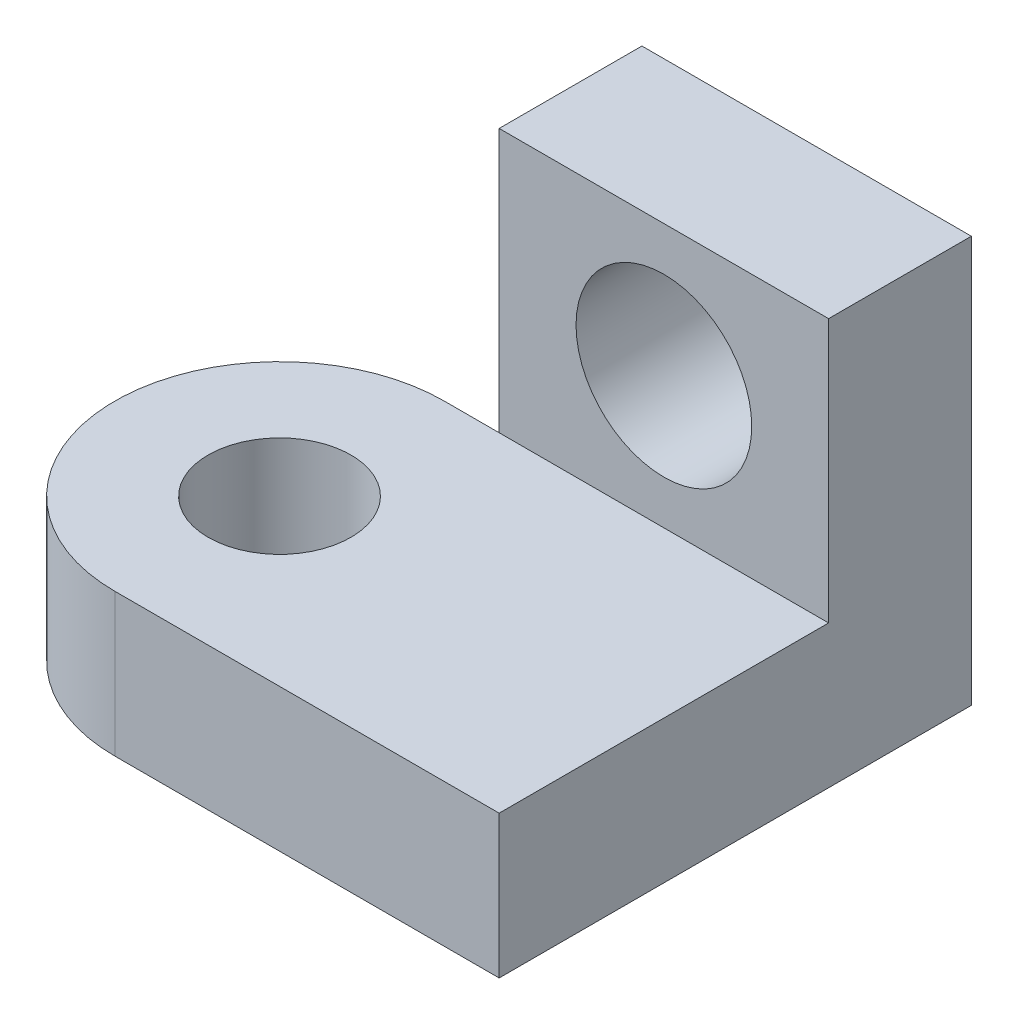
ISO-10303-21;
HEADER;
FILE_DESCRIPTION(('STEP AP214'),'2;1');
FILE_NAME('part.step','',(''),(''),'','','');
FILE_SCHEMA(('AUTOMOTIVE_DESIGN { 1 0 10303 214 1 1 1 1 }'));
ENDSEC;
DATA;
#1=APPLICATION_CONTEXT('core data for automotive mechanical design processes');
#2=APPLICATION_PROTOCOL_DEFINITION('international standard','automotive_design',2000,#1);
#3=PRODUCT_CONTEXT('',#1,'mechanical');
#4=PRODUCT('Part','Part','',(#3));
#5=PRODUCT_RELATED_PRODUCT_CATEGORY('part','',(#4));
#6=PRODUCT_DEFINITION_FORMATION('','',#4);
#7=PRODUCT_DEFINITION_CONTEXT('part definition',#1,'design');
#8=PRODUCT_DEFINITION('design','',#6,#7);
#9=PRODUCT_DEFINITION_SHAPE('','',#8);
#10=(LENGTH_UNIT() NAMED_UNIT(*) SI_UNIT(.MILLI.,.METRE.));
#11=(NAMED_UNIT(*) PLANE_ANGLE_UNIT() SI_UNIT($,.RADIAN.));
#12=(NAMED_UNIT(*) SI_UNIT($,.STERADIAN.) SOLID_ANGLE_UNIT());
#13=UNCERTAINTY_MEASURE_WITH_UNIT(LENGTH_MEASURE(1.E-05),#10,'distance_accuracy_value','');
#14=(GEOMETRIC_REPRESENTATION_CONTEXT(3) GLOBAL_UNCERTAINTY_ASSIGNED_CONTEXT((#13)) GLOBAL_UNIT_ASSIGNED_CONTEXT((#10,
#11,#12)) REPRESENTATION_CONTEXT('',''));
#15=CARTESIAN_POINT('',(0.,0.,0.));
#16=DIRECTION('',(0.,0.,1.));
#17=DIRECTION('',(1.,0.,0.));
#18=AXIS2_PLACEMENT_3D('',#15,#16,#17);
#19=CARTESIAN_POINT('',(0.,0.,13.));
#20=DIRECTION('',(0.,0.,-1.));
#21=DIRECTION('',(-1.,0.,0.));
#22=AXIS2_PLACEMENT_3D('',#19,#20,#21);
#23=PLANE('',#22);
#24=CARTESIAN_POINT('',(15.,12.,13.));
#25=DIRECTION('',(0.,0.,1.));
#26=DIRECTION('',(1.,0.,0.));
#27=AXIS2_PLACEMENT_3D('',#24,#25,#26);
#28=CIRCLE('',#27,8.);
#29=CARTESIAN_POINT('',(6.99999999999999,12.,13.));
#30=VERTEX_POINT('',#29);
#31=EDGE_CURVE('E145',#30,#30,#28,.T.);
#32=ORIENTED_EDGE('',*,*,#31,.F.);
#33=EDGE_LOOP('',(#32));
#34=FACE_BOUND('',#33,.T.);
#35=DIRECTION('',(1.,0.,0.));
#36=VECTOR('',#35,1.);
#37=CARTESIAN_POINT('',(-5.,0.,13.));
#38=LINE('',#37,#36);
#39=CARTESIAN_POINT('',(0.,0.,13.));
#40=VERTEX_POINT('',#39);
#41=CARTESIAN_POINT('',(30.,0.,13.));
#42=VERTEX_POINT('',#41);
#43=EDGE_CURVE('E89',#40,#42,#38,.T.);
#44=ORIENTED_EDGE('',*,*,#43,.T.);
#45=DIRECTION('',(0.,1.,0.));
#46=VECTOR('',#45,1.);
#47=CARTESIAN_POINT('',(30.,24.,13.));
#48=LINE('',#47,#46);
#49=CARTESIAN_POINT('',(30.,24.,13.));
#50=VERTEX_POINT('',#49);
#51=EDGE_CURVE('E130',#42,#50,#48,.T.);
#52=ORIENTED_EDGE('',*,*,#51,.T.);
#53=DIRECTION('',(-1.,0.,0.));
#54=VECTOR('',#53,1.);
#55=CARTESIAN_POINT('',(0.,24.,13.));
#56=LINE('',#55,#54);
#57=CARTESIAN_POINT('',(0.,24.,13.));
#58=VERTEX_POINT('',#57);
#59=EDGE_CURVE('E52',#50,#58,#56,.T.);
#60=ORIENTED_EDGE('',*,*,#59,.T.);
#61=DIRECTION('',(0.,-1.,0.));
#62=VECTOR('',#61,1.);
#63=CARTESIAN_POINT('',(0.,0.,13.));
#64=LINE('',#63,#62);
#65=EDGE_CURVE('E132',#58,#40,#64,.T.);
#66=ORIENTED_EDGE('',*,*,#65,.T.);
#67=EDGE_LOOP('',(#44,#52,#60,#66));
#68=FACE_BOUND('',#67,.T.);
#69=ADVANCED_FACE('F35',(#34,#68),#23,.F.);
#70=CARTESIAN_POINT('',(0.,0.,0.));
#71=DIRECTION('',(0.,0.,-1.));
#72=DIRECTION('',(-1.,0.,0.));
#73=AXIS2_PLACEMENT_3D('',#70,#71,#72);
#74=PLANE('',#73);
#75=DIRECTION('',(0.,1.,0.));
#76=VECTOR('',#75,1.);
#77=CARTESIAN_POINT('',(30.,24.,0.));
#78=LINE('',#77,#76);
#79=CARTESIAN_POINT('',(30.,-13.,0.));
#80=VERTEX_POINT('',#79);
#81=CARTESIAN_POINT('',(30.,24.,0.));
#82=VERTEX_POINT('',#81);
#83=EDGE_CURVE('E63',#80,#82,#78,.T.);
#84=ORIENTED_EDGE('',*,*,#83,.F.);
#85=DIRECTION('',(-1.,0.,0.));
#86=VECTOR('',#85,1.);
#87=CARTESIAN_POINT('',(30.,-13.,0.));
#88=LINE('',#87,#86);
#89=CARTESIAN_POINT('',(0.,-13.,0.));
#90=VERTEX_POINT('',#89);
#91=EDGE_CURVE('E152',#80,#90,#88,.T.);
#92=ORIENTED_EDGE('',*,*,#91,.T.);
#93=DIRECTION('',(0.,-1.,0.));
#94=VECTOR('',#93,1.);
#95=CARTESIAN_POINT('',(0.,0.,0.));
#96=LINE('',#95,#94);
#97=CARTESIAN_POINT('',(0.,24.,0.));
#98=VERTEX_POINT('',#97);
#99=EDGE_CURVE('E81',#98,#90,#96,.T.);
#100=ORIENTED_EDGE('',*,*,#99,.F.);
#101=DIRECTION('',(-1.,0.,0.));
#102=VECTOR('',#101,1.);
#103=CARTESIAN_POINT('',(0.,24.,0.));
#104=LINE('',#103,#102);
#105=EDGE_CURVE('E137',#82,#98,#104,.T.);
#106=ORIENTED_EDGE('',*,*,#105,.F.);
#107=EDGE_LOOP('',(#84,#92,#100,#106));
#108=FACE_BOUND('',#107,.T.);
#109=CARTESIAN_POINT('',(15.,12.,0.));
#110=DIRECTION('',(0.,0.,1.));
#111=DIRECTION('',(1.,0.,0.));
#112=AXIS2_PLACEMENT_3D('',#109,#110,#111);
#113=CIRCLE('',#112,8.);
#114=CARTESIAN_POINT('',(6.99999999999999,12.,0.));
#115=VERTEX_POINT('',#114);
#116=EDGE_CURVE('E140',#115,#115,#113,.T.);
#117=ORIENTED_EDGE('',*,*,#116,.T.);
#118=EDGE_LOOP('',(#117));
#119=FACE_BOUND('',#118,.T.);
#120=ADVANCED_FACE('F149',(#108,#119),#74,.T.);
#121=CARTESIAN_POINT('',(30.,24.,13.));
#122=DIRECTION('',(-1.,0.,0.));
#123=DIRECTION('',(0.,-1.,0.));
#124=AXIS2_PLACEMENT_3D('',#121,#122,#123);
#125=PLANE('',#124);
#126=ORIENTED_EDGE('',*,*,#83,.T.);
#127=DIRECTION('',(0.,0.,-1.));
#128=VECTOR('',#127,1.);
#129=CARTESIAN_POINT('',(30.,24.,13.));
#130=LINE('',#129,#128);
#131=EDGE_CURVE('E11',#50,#82,#130,.T.);
#132=ORIENTED_EDGE('',*,*,#131,.F.);
#133=ORIENTED_EDGE('',*,*,#51,.F.);
#134=DIRECTION('',(0.,0.,1.));
#135=VECTOR('',#134,1.);
#136=CARTESIAN_POINT('',(30.,0.,13.));
#137=LINE('',#136,#135);
#138=CARTESIAN_POINT('',(30.,0.,42.999997730488));
#139=VERTEX_POINT('',#138);
#140=EDGE_CURVE('E121',#42,#139,#137,.T.);
#141=ORIENTED_EDGE('',*,*,#140,.T.);
#142=DIRECTION('',(0.,-1.,0.));
#143=VECTOR('',#142,1.);
#144=CARTESIAN_POINT('',(30.,0.,42.999997730488));
#145=LINE('',#144,#143);
#146=CARTESIAN_POINT('',(30.,-13.,42.999997730488));
#147=VERTEX_POINT('',#146);
#148=EDGE_CURVE('E308',#139,#147,#145,.T.);
#149=ORIENTED_EDGE('',*,*,#148,.T.);
#150=DIRECTION('',(0.,0.,-1.));
#151=VECTOR('',#150,1.);
#152=CARTESIAN_POINT('',(30.,-13.,13.));
#153=LINE('',#152,#151);
#154=EDGE_CURVE('E154',#147,#80,#153,.T.);
#155=ORIENTED_EDGE('',*,*,#154,.T.);
#156=EDGE_LOOP('',(#126,#132,#133,#141,#149,#155));
#157=FACE_BOUND('',#156,.T.);
#158=ADVANCED_FACE('F37',(#157),#125,.F.);
#159=CARTESIAN_POINT('',(0.,24.,13.));
#160=DIRECTION('',(0.,-1.,0.));
#161=DIRECTION('',(0.,0.,-1.));
#162=AXIS2_PLACEMENT_3D('',#159,#160,#161);
#163=PLANE('',#162);
#164=ORIENTED_EDGE('',*,*,#105,.T.);
#165=DIRECTION('',(0.,0.,-1.));
#166=VECTOR('',#165,1.);
#167=CARTESIAN_POINT('',(0.,24.,13.));
#168=LINE('',#167,#166);
#169=EDGE_CURVE('E44',#58,#98,#168,.T.);
#170=ORIENTED_EDGE('',*,*,#169,.F.);
#171=ORIENTED_EDGE('',*,*,#59,.F.);
#172=ORIENTED_EDGE('',*,*,#131,.T.);
#173=EDGE_LOOP('',(#164,#170,#171,#172));
#174=FACE_BOUND('',#173,.T.);
#175=ADVANCED_FACE('F176',(#174),#163,.F.);
#176=CARTESIAN_POINT('',(0.,0.,13.));
#177=DIRECTION('',(1.,0.,0.));
#178=DIRECTION('',(0.,0.,-1.));
#179=AXIS2_PLACEMENT_3D('',#176,#177,#178);
#180=PLANE('',#179);
#181=ORIENTED_EDGE('',*,*,#99,.T.);
#182=DIRECTION('',(0.,0.,-1.));
#183=VECTOR('',#182,1.);
#184=CARTESIAN_POINT('',(0.,-13.,13.));
#185=LINE('',#184,#183);
#186=CARTESIAN_POINT('',(0.,-13.,13.));
#187=VERTEX_POINT('',#186);
#188=EDGE_CURVE('E157',#187,#90,#185,.T.);
#189=ORIENTED_EDGE('',*,*,#188,.F.);
#190=DIRECTION('',(0.,1.,0.));
#191=VECTOR('',#190,1.);
#192=CARTESIAN_POINT('',(0.,0.,13.));
#193=LINE('',#192,#191);
#194=EDGE_CURVE('E307',#187,#40,#193,.T.);
#195=ORIENTED_EDGE('',*,*,#194,.T.);
#196=ORIENTED_EDGE('',*,*,#65,.F.);
#197=ORIENTED_EDGE('',*,*,#169,.T.);
#198=EDGE_LOOP('',(#181,#189,#195,#196,#197));
#199=FACE_BOUND('',#198,.T.);
#200=ADVANCED_FACE('F146',(#199),#180,.F.);
#201=CARTESIAN_POINT('',(15.,12.,13.));
#202=DIRECTION('',(0.,0.,-1.));
#203=DIRECTION('',(-1.,0.,0.));
#204=AXIS2_PLACEMENT_3D('',#201,#202,#203);
#205=CYLINDRICAL_SURFACE('',#204,8.);
#206=CARTESIAN_POINT('',(6.99999999999999,12.,13.));
#207=CARTESIAN_POINT('',(6.99999999999999,12.,12.8645833333333));
#208=CARTESIAN_POINT('',(6.99999999999999,12.,12.7291666666667));
#209=CARTESIAN_POINT('',(6.99999999999999,12.,12.4583333333333));
#210=CARTESIAN_POINT('',(6.99999999999999,12.,12.3229166666667));
#211=CARTESIAN_POINT('',(6.99999999999999,12.,12.0520833333333));
#212=CARTESIAN_POINT('',(6.99999999999999,12.,11.9166666666667));
#213=CARTESIAN_POINT('',(6.99999999999999,12.,11.6458333333333));
#214=CARTESIAN_POINT('',(6.99999999999999,12.,11.5104166666667));
#215=CARTESIAN_POINT('',(6.99999999999999,12.,11.2395833333333));
#216=CARTESIAN_POINT('',(6.99999999999999,12.,11.1041666666667));
#217=CARTESIAN_POINT('',(6.99999999999999,12.,10.8333333333333));
#218=CARTESIAN_POINT('',(6.99999999999999,12.,10.6979166666667));
#219=CARTESIAN_POINT('',(6.99999999999999,12.,10.4270833333333));
#220=CARTESIAN_POINT('',(6.99999999999999,12.,10.2916666666667));
#221=CARTESIAN_POINT('',(6.99999999999999,12.,10.0208333333333));
#222=CARTESIAN_POINT('',(6.99999999999999,12.,9.88541666666667));
#223=CARTESIAN_POINT('',(6.99999999999999,12.,9.61458333333333));
#224=CARTESIAN_POINT('',(6.99999999999999,12.,9.47916666666667));
#225=CARTESIAN_POINT('',(6.99999999999999,12.,9.20833333333333));
#226=CARTESIAN_POINT('',(6.99999999999999,12.,9.07291666666666));
#227=CARTESIAN_POINT('',(6.99999999999999,12.,8.80208333333333));
#228=CARTESIAN_POINT('',(6.99999999999999,12.,8.66666666666667));
#229=CARTESIAN_POINT('',(6.99999999999999,12.,8.39583333333333));
#230=CARTESIAN_POINT('',(6.99999999999999,12.,8.26041666666667));
#231=CARTESIAN_POINT('',(6.99999999999999,12.,7.98958333333333));
#232=CARTESIAN_POINT('',(6.99999999999999,12.,7.85416666666667));
#233=CARTESIAN_POINT('',(6.99999999999999,12.,7.58333333333333));
#234=CARTESIAN_POINT('',(6.99999999999999,12.,7.44791666666667));
#235=CARTESIAN_POINT('',(6.99999999999999,12.,7.17708333333333));
#236=CARTESIAN_POINT('',(6.99999999999999,12.,7.04166666666667));
#237=CARTESIAN_POINT('',(6.99999999999999,12.,6.77083333333333));
#238=CARTESIAN_POINT('',(6.99999999999999,12.,6.63541666666667));
#239=CARTESIAN_POINT('',(6.99999999999999,12.,6.36458333333333));
#240=CARTESIAN_POINT('',(6.99999999999999,12.,6.22916666666667));
#241=CARTESIAN_POINT('',(6.99999999999999,12.,5.95833333333333));
#242=CARTESIAN_POINT('',(6.99999999999999,12.,5.82291666666667));
#243=CARTESIAN_POINT('',(6.99999999999999,12.,5.55208333333333));
#244=CARTESIAN_POINT('',(6.99999999999999,12.,5.41666666666667));
#245=CARTESIAN_POINT('',(6.99999999999999,12.,5.14583333333333));
#246=CARTESIAN_POINT('',(6.99999999999999,12.,5.01041666666667));
#247=CARTESIAN_POINT('',(6.99999999999999,12.,4.73958333333333));
#248=CARTESIAN_POINT('',(6.99999999999999,12.,4.60416666666667));
#249=CARTESIAN_POINT('',(6.99999999999999,12.,4.33333333333333));
#250=CARTESIAN_POINT('',(6.99999999999999,12.,4.19791666666667));
#251=CARTESIAN_POINT('',(6.99999999999999,12.,3.92708333333333));
#252=CARTESIAN_POINT('',(6.99999999999999,12.,3.79166666666667));
#253=CARTESIAN_POINT('',(6.99999999999999,12.,3.52083333333333));
#254=CARTESIAN_POINT('',(6.99999999999999,12.,3.38541666666667));
#255=CARTESIAN_POINT('',(6.99999999999999,12.,3.11458333333333));
#256=CARTESIAN_POINT('',(6.99999999999999,12.,2.97916666666667));
#257=CARTESIAN_POINT('',(6.99999999999999,12.,2.70833333333333));
#258=CARTESIAN_POINT('',(6.99999999999999,12.,2.57291666666667));
#259=CARTESIAN_POINT('',(6.99999999999999,12.,2.30208333333333));
#260=CARTESIAN_POINT('',(6.99999999999999,12.,2.16666666666667));
#261=CARTESIAN_POINT('',(6.99999999999999,12.,1.89583333333333));
#262=CARTESIAN_POINT('',(6.99999999999999,12.,1.76041666666667));
#263=CARTESIAN_POINT('',(6.99999999999999,12.,1.48958333333333));
#264=CARTESIAN_POINT('',(6.99999999999999,12.,1.35416666666667));
#265=CARTESIAN_POINT('',(6.99999999999999,12.,1.08333333333333));
#266=CARTESIAN_POINT('',(6.99999999999999,12.,0.947916666666667));
#267=CARTESIAN_POINT('',(6.99999999999999,12.,0.677083333333334));
#268=CARTESIAN_POINT('',(6.99999999999999,12.,0.541666666666667));
#269=CARTESIAN_POINT('',(6.99999999999999,12.,0.270833333333334));
#270=CARTESIAN_POINT('',(6.99999999999999,12.,0.135416666666667));
#271=CARTESIAN_POINT('',(6.99999999999999,12.,0.));
#272=B_SPLINE_CURVE_WITH_KNOTS('',3,(#206,#207,#208,#209,#210,#211,#212,#213,#214,#215,#216,
#217,#218,#219,#220,#221,#222,#223,#224,#225,#226,#227,#228,#229,#230,#231,#232,#233,#234,#235,
#236,#237,#238,#239,#240,#241,#242,#243,#244,#245,#246,#247,#248,#249,#250,#251,#252,#253,#254,
#255,#256,#257,#258,#259,#260,#261,#262,#263,#264,#265,#266,#267,#268,#269,#270,#271),
.UNSPECIFIED.,.F.,.F.,(4,2,2,2,2,2,2,2,2,2,2,2,2,2,2,2,2,2,2,2,2,2,2,2,2,2,2,2,2,2,2,2,4),(0.,
0.40625,0.812500000000001,1.21875,1.625,2.03125,2.4375,2.84375,3.25,3.65625,4.0625,4.46875,
4.875,5.28125,5.6875,6.09375,6.5,6.90625,7.3125,7.71875,8.125,8.53125,8.9375,9.34375,9.75,
10.15625,10.5625,10.96875,11.375,11.78125,12.1875,12.59375,13.),.UNSPECIFIED.);
#273=EDGE_CURVE('BSEAM163',#30,#115,#272,.T.);
#274=ORIENTED_EDGE('',*,*,#31,.T.);
#275=ORIENTED_EDGE('',*,*,#116,.F.);
#276=ORIENTED_EDGE('',*,*,#273,.T.);
#277=ORIENTED_EDGE('',*,*,#273,.F.);
#278=EDGE_LOOP('',(#274,#276,#275,#277));
#279=FACE_BOUND('',#278,.T.);
#280=ADVANCED_FACE('F163',(#279),#205,.F.);
#281=CARTESIAN_POINT('',(30.,-13.,13.));
#282=DIRECTION('',(0.,1.,0.));
#283=DIRECTION('',(0.,0.,1.));
#284=AXIS2_PLACEMENT_3D('',#281,#282,#283);
#285=PLANE('',#284);
#286=CARTESIAN_POINT('',(-5.,-13.,27.999998865244));
#287=DIRECTION('',(0.,1.,0.));
#288=DIRECTION('',(0.,0.,1.));
#289=AXIS2_PLACEMENT_3D('',#286,#287,#288);
#290=CIRCLE('',#289,6.5);
#291=CARTESIAN_POINT('',(-5.,-13.,34.499998865244));
#292=VERTEX_POINT('',#291);
#293=EDGE_CURVE('E290',#292,#292,#290,.T.);
#294=ORIENTED_EDGE('',*,*,#293,.T.);
#295=EDGE_LOOP('',(#294));
#296=FACE_BOUND('',#295,.T.);
#297=ORIENTED_EDGE('',*,*,#188,.T.);
#298=ORIENTED_EDGE('',*,*,#91,.F.);
#299=ORIENTED_EDGE('',*,*,#154,.F.);
#300=DIRECTION('',(1.,0.,0.));
#301=VECTOR('',#300,1.);
#302=CARTESIAN_POINT('',(-5.,-13.,42.999997730488));
#303=LINE('',#302,#301);
#304=CARTESIAN_POINT('',(-5.,-13.,42.999997730488));
#305=VERTEX_POINT('',#304);
#306=EDGE_CURVE('E298',#305,#147,#303,.T.);
#307=ORIENTED_EDGE('',*,*,#306,.F.);
#308=CARTESIAN_POINT('',(-5.,-13.,27.999998865244));
#309=DIRECTION('',(0.,-1.,0.));
#310=DIRECTION('',(0.,0.,-1.));
#311=AXIS2_PLACEMENT_3D('',#308,#309,#310);
#312=CIRCLE('',#311,14.999998865244);
#313=CARTESIAN_POINT('',(-5.,-13.,13.));
#314=VERTEX_POINT('',#313);
#315=EDGE_CURVE('E295',#305,#314,#312,.T.);
#316=ORIENTED_EDGE('',*,*,#315,.T.);
#317=DIRECTION('',(1.,0.,0.));
#318=VECTOR('',#317,1.);
#319=CARTESIAN_POINT('',(-5.,-13.,13.));
#320=LINE('',#319,#318);
#321=EDGE_CURVE('E303',#314,#187,#320,.T.);
#322=ORIENTED_EDGE('',*,*,#321,.T.);
#323=EDGE_LOOP('',(#297,#298,#299,#307,#316,#322));
#324=FACE_BOUND('',#323,.T.);
#325=ADVANCED_FACE('F213',(#296,#324),#285,.F.);
#326=CARTESIAN_POINT('',(-5.,0.,13.));
#327=DIRECTION('',(0.,0.,-1.));
#328=DIRECTION('',(0.,1.,0.));
#329=AXIS2_PLACEMENT_3D('',#326,#327,#328);
#330=PLANE('',#329);
#331=ORIENTED_EDGE('',*,*,#194,.F.);
#332=ORIENTED_EDGE('',*,*,#321,.F.);
#333=DIRECTION('',(0.,-1.,0.));
#334=VECTOR('',#333,1.);
#335=CARTESIAN_POINT('',(-5.,0.,13.));
#336=LINE('',#335,#334);
#337=CARTESIAN_POINT('',(-5.,0.,13.));
#338=VERTEX_POINT('',#337);
#339=EDGE_CURVE('E119',#338,#314,#336,.T.);
#340=ORIENTED_EDGE('',*,*,#339,.F.);
#341=EDGE_CURVE('E128',#338,#40,#38,.T.);
#342=ORIENTED_EDGE('',*,*,#341,.T.);
#343=EDGE_LOOP('',(#331,#332,#340,#342));
#344=FACE_BOUND('',#343,.T.);
#345=ADVANCED_FACE('F219',(#344),#330,.T.);
#346=CARTESIAN_POINT('',(-5.,0.,27.999998865244));
#347=DIRECTION('',(0.,-1.,0.));
#348=DIRECTION('',(0.,0.,-1.));
#349=AXIS2_PLACEMENT_3D('',#346,#347,#348);
#350=CYLINDRICAL_SURFACE('',#349,14.999998865244);
#351=ORIENTED_EDGE('',*,*,#315,.F.);
#352=DIRECTION('',(0.,-1.,0.));
#353=VECTOR('',#352,1.);
#354=CARTESIAN_POINT('',(-5.,0.,42.999997730488));
#355=LINE('',#354,#353);
#356=CARTESIAN_POINT('',(-5.,0.,42.999997730488));
#357=VERTEX_POINT('',#356);
#358=EDGE_CURVE('E98',#357,#305,#355,.T.);
#359=ORIENTED_EDGE('',*,*,#358,.F.);
#360=CARTESIAN_POINT('',(-5.,0.,27.999998865244));
#361=DIRECTION('',(0.,-1.,0.));
#362=DIRECTION('',(0.,0.,-1.));
#363=AXIS2_PLACEMENT_3D('',#360,#361,#362);
#364=CIRCLE('',#363,14.999998865244);
#365=EDGE_CURVE('E133',#357,#338,#364,.T.);
#366=ORIENTED_EDGE('',*,*,#365,.T.);
#367=ORIENTED_EDGE('',*,*,#339,.T.);
#368=EDGE_LOOP('',(#351,#359,#366,#367));
#369=FACE_BOUND('',#368,.T.);
#370=ADVANCED_FACE('F231',(#369),#350,.T.);
#371=CARTESIAN_POINT('',(-5.,0.,42.999997730488));
#372=DIRECTION('',(0.,0.,-1.));
#373=DIRECTION('',(0.,1.,0.));
#374=AXIS2_PLACEMENT_3D('',#371,#372,#373);
#375=PLANE('',#374);
#376=ORIENTED_EDGE('',*,*,#306,.T.);
#377=ORIENTED_EDGE('',*,*,#148,.F.);
#378=DIRECTION('',(1.,0.,0.));
#379=VECTOR('',#378,1.);
#380=CARTESIAN_POINT('',(-5.,0.,42.999997730488));
#381=LINE('',#380,#379);
#382=EDGE_CURVE('E124',#357,#139,#381,.T.);
#383=ORIENTED_EDGE('',*,*,#382,.F.);
#384=ORIENTED_EDGE('',*,*,#358,.T.);
#385=EDGE_LOOP('',(#376,#377,#383,#384));
#386=FACE_BOUND('',#385,.T.);
#387=ADVANCED_FACE('F239',(#386),#375,.F.);
#388=CARTESIAN_POINT('',(-5.,0.,27.999998865244));
#389=DIRECTION('',(0.,-1.,0.));
#390=DIRECTION('',(0.,0.,-1.));
#391=AXIS2_PLACEMENT_3D('',#388,#389,#390);
#392=PLANE('',#391);
#393=CARTESIAN_POINT('',(-5.,0.,27.999998865244));
#394=DIRECTION('',(0.,1.,0.));
#395=DIRECTION('',(0.,0.,1.));
#396=AXIS2_PLACEMENT_3D('',#393,#394,#395);
#397=CIRCLE('',#396,6.5);
#398=CARTESIAN_POINT('',(-5.,0.,34.499998865244));
#399=VERTEX_POINT('',#398);
#400=EDGE_CURVE('E293',#399,#399,#397,.T.);
#401=ORIENTED_EDGE('',*,*,#400,.F.);
#402=EDGE_LOOP('',(#401));
#403=FACE_BOUND('',#402,.T.);
#404=ORIENTED_EDGE('',*,*,#365,.F.);
#405=ORIENTED_EDGE('',*,*,#382,.T.);
#406=ORIENTED_EDGE('',*,*,#140,.F.);
#407=ORIENTED_EDGE('',*,*,#43,.F.);
#408=ORIENTED_EDGE('',*,*,#341,.F.);
#409=EDGE_LOOP('',(#404,#405,#406,#407,#408));
#410=FACE_BOUND('',#409,.T.);
#411=ADVANCED_FACE('F123',(#403,#410),#392,.F.);
#412=CARTESIAN_POINT('',(-5.,-13.,27.999998865244));
#413=DIRECTION('',(0.,1.,0.));
#414=DIRECTION('',(0.,0.,1.));
#415=AXIS2_PLACEMENT_3D('',#412,#413,#414);
#416=CYLINDRICAL_SURFACE('',#415,6.5);
#417=CARTESIAN_POINT('',(-5.,-13.,34.499998865244));
#418=CARTESIAN_POINT('',(-5.,-12.8645833333333,34.499998865244));
#419=CARTESIAN_POINT('',(-5.,-12.7291666666667,34.499998865244));
#420=CARTESIAN_POINT('',(-5.,-12.4583333333333,34.499998865244));
#421=CARTESIAN_POINT('',(-5.,-12.3229166666667,34.499998865244));
#422=CARTESIAN_POINT('',(-5.,-12.0520833333333,34.499998865244));
#423=CARTESIAN_POINT('',(-5.,-11.9166666666667,34.499998865244));
#424=CARTESIAN_POINT('',(-5.,-11.6458333333333,34.499998865244));
#425=CARTESIAN_POINT('',(-5.,-11.5104166666667,34.499998865244));
#426=CARTESIAN_POINT('',(-5.,-11.2395833333333,34.499998865244));
#427=CARTESIAN_POINT('',(-5.,-11.1041666666667,34.499998865244));
#428=CARTESIAN_POINT('',(-5.,-10.8333333333333,34.499998865244));
#429=CARTESIAN_POINT('',(-5.,-10.6979166666667,34.499998865244));
#430=CARTESIAN_POINT('',(-5.,-10.4270833333333,34.499998865244));
#431=CARTESIAN_POINT('',(-5.,-10.2916666666667,34.499998865244));
#432=CARTESIAN_POINT('',(-5.,-10.0208333333333,34.499998865244));
#433=CARTESIAN_POINT('',(-5.,-9.88541666666667,34.499998865244));
#434=CARTESIAN_POINT('',(-5.,-9.61458333333333,34.499998865244));
#435=CARTESIAN_POINT('',(-5.,-9.47916666666667,34.499998865244));
#436=CARTESIAN_POINT('',(-5.,-9.20833333333333,34.499998865244));
#437=CARTESIAN_POINT('',(-5.,-9.07291666666666,34.499998865244));
#438=CARTESIAN_POINT('',(-5.,-8.80208333333333,34.499998865244));
#439=CARTESIAN_POINT('',(-5.,-8.66666666666667,34.499998865244));
#440=CARTESIAN_POINT('',(-5.,-8.39583333333333,34.499998865244));
#441=CARTESIAN_POINT('',(-5.,-8.26041666666667,34.499998865244));
#442=CARTESIAN_POINT('',(-5.,-7.98958333333333,34.499998865244));
#443=CARTESIAN_POINT('',(-5.,-7.85416666666667,34.499998865244));
#444=CARTESIAN_POINT('',(-5.,-7.58333333333333,34.499998865244));
#445=CARTESIAN_POINT('',(-5.,-7.44791666666667,34.499998865244));
#446=CARTESIAN_POINT('',(-5.,-7.17708333333333,34.499998865244));
#447=CARTESIAN_POINT('',(-5.,-7.04166666666667,34.499998865244));
#448=CARTESIAN_POINT('',(-5.,-6.77083333333333,34.499998865244));
#449=CARTESIAN_POINT('',(-5.,-6.63541666666666,34.499998865244));
#450=CARTESIAN_POINT('',(-5.,-6.36458333333333,34.499998865244));
#451=CARTESIAN_POINT('',(-5.,-6.22916666666666,34.499998865244));
#452=CARTESIAN_POINT('',(-5.,-5.95833333333333,34.499998865244));
#453=CARTESIAN_POINT('',(-5.,-5.82291666666666,34.499998865244));
#454=CARTESIAN_POINT('',(-5.,-5.55208333333333,34.499998865244));
#455=CARTESIAN_POINT('',(-5.,-5.41666666666666,34.499998865244));
#456=CARTESIAN_POINT('',(-5.,-5.14583333333333,34.499998865244));
#457=CARTESIAN_POINT('',(-5.,-5.01041666666666,34.499998865244));
#458=CARTESIAN_POINT('',(-5.,-4.73958333333333,34.499998865244));
#459=CARTESIAN_POINT('',(-5.,-4.60416666666666,34.499998865244));
#460=CARTESIAN_POINT('',(-5.,-4.33333333333333,34.499998865244));
#461=CARTESIAN_POINT('',(-5.,-4.19791666666666,34.499998865244));
#462=CARTESIAN_POINT('',(-5.,-3.92708333333333,34.499998865244));
#463=CARTESIAN_POINT('',(-5.,-3.79166666666666,34.499998865244));
#464=CARTESIAN_POINT('',(-5.,-3.52083333333333,34.499998865244));
#465=CARTESIAN_POINT('',(-5.,-3.38541666666666,34.499998865244));
#466=CARTESIAN_POINT('',(-5.,-3.11458333333333,34.499998865244));
#467=CARTESIAN_POINT('',(-5.,-2.97916666666666,34.499998865244));
#468=CARTESIAN_POINT('',(-5.,-2.70833333333333,34.499998865244));
#469=CARTESIAN_POINT('',(-5.,-2.57291666666666,34.499998865244));
#470=CARTESIAN_POINT('',(-5.,-2.30208333333333,34.499998865244));
#471=CARTESIAN_POINT('',(-5.,-2.16666666666666,34.499998865244));
#472=CARTESIAN_POINT('',(-5.,-1.89583333333333,34.499998865244));
#473=CARTESIAN_POINT('',(-5.,-1.76041666666666,34.499998865244));
#474=CARTESIAN_POINT('',(-5.,-1.48958333333333,34.499998865244));
#475=CARTESIAN_POINT('',(-5.,-1.35416666666666,34.499998865244));
#476=CARTESIAN_POINT('',(-5.,-1.08333333333333,34.499998865244));
#477=CARTESIAN_POINT('',(-5.,-0.947916666666662,34.499998865244));
#478=CARTESIAN_POINT('',(-5.,-0.677083333333329,34.499998865244));
#479=CARTESIAN_POINT('',(-5.,-0.541666666666662,34.499998865244));
#480=CARTESIAN_POINT('',(-5.,-0.270833333333328,34.499998865244));
#481=CARTESIAN_POINT('',(-5.,-0.135416666666661,34.499998865244));
#482=CARTESIAN_POINT('',(-5.,0.,34.499998865244));
#483=B_SPLINE_CURVE_WITH_KNOTS('',3,(#417,#418,#419,#420,#421,#422,#423,#424,#425,#426,#427,
#428,#429,#430,#431,#432,#433,#434,#435,#436,#437,#438,#439,#440,#441,#442,#443,#444,#445,#446,
#447,#448,#449,#450,#451,#452,#453,#454,#455,#456,#457,#458,#459,#460,#461,#462,#463,#464,#465,
#466,#467,#468,#469,#470,#471,#472,#473,#474,#475,#476,#477,#478,#479,#480,#481,#482),
.UNSPECIFIED.,.F.,.F.,(4,2,2,2,2,2,2,2,2,2,2,2,2,2,2,2,2,2,2,2,2,2,2,2,2,2,2,2,2,2,2,2,4),(0.,
0.406249999999999,0.812499999999999,1.21875,1.625,2.03125,2.4375,2.84375,3.25,3.65625,4.0625,
4.46875,4.875,5.28125,5.6875,6.09375,6.5,6.90625,7.3125,7.71875,8.125,8.53125,8.9375,9.34375,
9.75,10.15625,10.5625,10.96875,11.375,11.78125,12.1875,12.59375,13.),.UNSPECIFIED.);
#484=EDGE_CURVE('BSEAM252',#292,#399,#483,.T.);
#485=ORIENTED_EDGE('',*,*,#293,.F.);
#486=ORIENTED_EDGE('',*,*,#400,.T.);
#487=ORIENTED_EDGE('',*,*,#484,.T.);
#488=ORIENTED_EDGE('',*,*,#484,.F.);
#489=EDGE_LOOP('',(#485,#487,#486,#488));
#490=FACE_BOUND('',#489,.T.);
#491=ADVANCED_FACE('F252',(#490),#416,.F.);
#492=CLOSED_SHELL('',(#69,#120,#158,#175,#200,#280,#325,#345,#370,#387,#411,#491));
#493=MANIFOLD_SOLID_BREP('B2',#492);
#494=ADVANCED_BREP_SHAPE_REPRESENTATION('',(#18,#493),#14);
#495=SHAPE_DEFINITION_REPRESENTATION(#9,#494);
ENDSEC;
END-ISO-10303-21;
